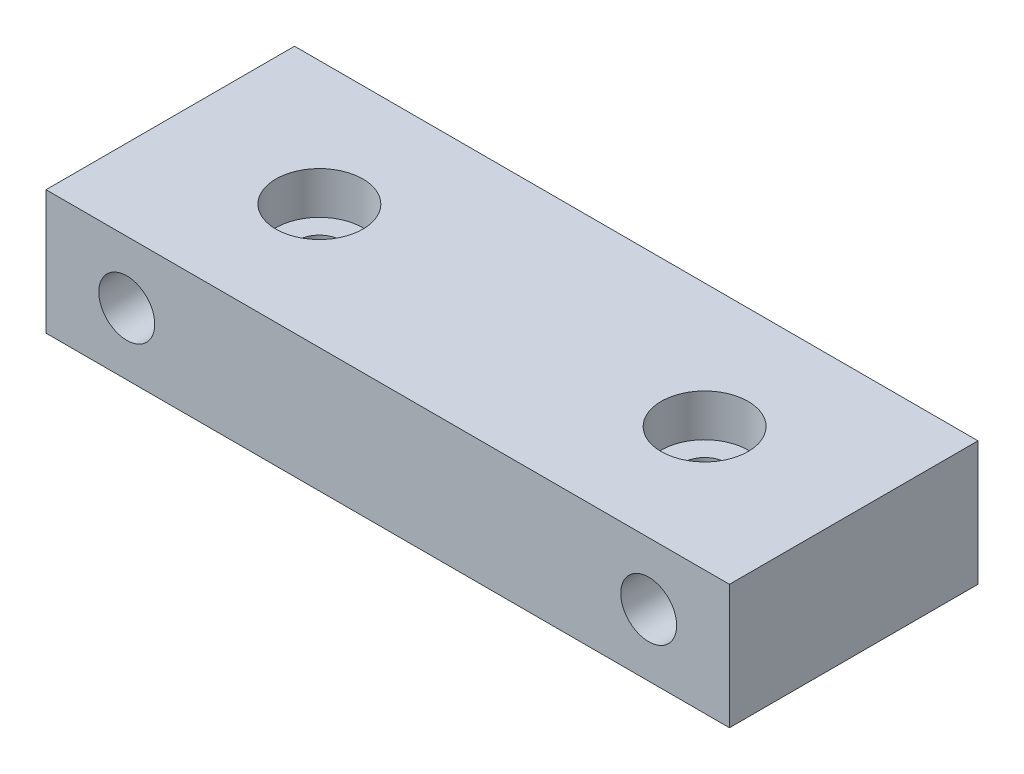
ISO-10303-21;
HEADER;
FILE_DESCRIPTION(('STEP AP214'),'2;1');
FILE_NAME('part.step','',(''),(''),'','','');
FILE_SCHEMA(('AUTOMOTIVE_DESIGN { 1 0 10303 214 1 1 1 1 }'));
ENDSEC;
DATA;
#1=APPLICATION_CONTEXT('core data for automotive mechanical design processes');
#2=APPLICATION_PROTOCOL_DEFINITION('international standard','automotive_design',2000,#1);
#3=PRODUCT_CONTEXT('',#1,'mechanical');
#4=PRODUCT('Part','Part','',(#3));
#5=PRODUCT_RELATED_PRODUCT_CATEGORY('part','',(#4));
#6=PRODUCT_DEFINITION_FORMATION('','',#4);
#7=PRODUCT_DEFINITION_CONTEXT('part definition',#1,'design');
#8=PRODUCT_DEFINITION('design','',#6,#7);
#9=PRODUCT_DEFINITION_SHAPE('','',#8);
#10=(LENGTH_UNIT() NAMED_UNIT(*) SI_UNIT(.MILLI.,.METRE.));
#11=(NAMED_UNIT(*) PLANE_ANGLE_UNIT() SI_UNIT($,.RADIAN.));
#12=(NAMED_UNIT(*) SI_UNIT($,.STERADIAN.) SOLID_ANGLE_UNIT());
#13=UNCERTAINTY_MEASURE_WITH_UNIT(LENGTH_MEASURE(1.E-05),#10,'distance_accuracy_value','');
#14=(GEOMETRIC_REPRESENTATION_CONTEXT(3) GLOBAL_UNCERTAINTY_ASSIGNED_CONTEXT((#13)) GLOBAL_UNIT_ASSIGNED_CONTEXT((#10,
#11,#12)) REPRESENTATION_CONTEXT('',''));
#15=CARTESIAN_POINT('',(0.,0.,0.));
#16=DIRECTION('',(0.,0.,1.));
#17=DIRECTION('',(1.,0.,0.));
#18=AXIS2_PLACEMENT_3D('',#15,#16,#17);
#19=CARTESIAN_POINT('',(21.,5.,-10.));
#20=DIRECTION('',(0.,0.,1.));
#21=DIRECTION('',(1.,0.,0.));
#22=AXIS2_PLACEMENT_3D('',#19,#20,#21);
#23=CYLINDRICAL_SURFACE('',#22,2.25);
#24=CARTESIAN_POINT('',(21.,5.,10.));
#25=DIRECTION('',(0.,0.,1.));
#26=DIRECTION('',(1.,0.,0.));
#27=AXIS2_PLACEMENT_3D('',#24,#25,#26);
#28=CIRCLE('',#27,2.25);
#29=CARTESIAN_POINT('',(23.25,5.,10.));
#30=VERTEX_POINT('',#29);
#31=EDGE_CURVE('E267',#30,#30,#28,.T.);
#32=ORIENTED_EDGE('',*,*,#31,.T.);
#33=EDGE_LOOP('',(#32));
#34=FACE_BOUND('',#33,.T.);
#35=CARTESIAN_POINT('',(21.,5.,-6.00000000000001));
#36=DIRECTION('',(0.,0.,-1.));
#37=DIRECTION('',(-1.,0.,0.));
#38=AXIS2_PLACEMENT_3D('',#35,#36,#37);
#39=CIRCLE('',#38,2.25);
#40=CARTESIAN_POINT('',(18.75,5.,-6.00000000000001));
#41=VERTEX_POINT('',#40);
#42=EDGE_CURVE('E37',#41,#41,#39,.F.);
#43=ORIENTED_EDGE('',*,*,#42,.F.);
#44=EDGE_LOOP('',(#43));
#45=FACE_BOUND('',#44,.T.);
#46=ADVANCED_FACE('F33',(#34,#45),#23,.F.);
#47=CARTESIAN_POINT('',(-21.,5.,-10.));
#48=DIRECTION('',(0.,0.,1.));
#49=DIRECTION('',(1.,0.,0.));
#50=AXIS2_PLACEMENT_3D('',#47,#48,#49);
#51=CYLINDRICAL_SURFACE('',#50,2.25);
#52=CARTESIAN_POINT('',(-21.,5.,10.));
#53=DIRECTION('',(0.,0.,1.));
#54=DIRECTION('',(1.,0.,0.));
#55=AXIS2_PLACEMENT_3D('',#52,#53,#54);
#56=CIRCLE('',#55,2.25);
#57=CARTESIAN_POINT('',(-18.75,5.,10.));
#58=VERTEX_POINT('',#57);
#59=EDGE_CURVE('E271',#58,#58,#56,.T.);
#60=ORIENTED_EDGE('',*,*,#59,.T.);
#61=EDGE_LOOP('',(#60));
#62=FACE_BOUND('',#61,.T.);
#63=CARTESIAN_POINT('',(-21.,5.,-6.00000000000001));
#64=DIRECTION('',(0.,0.,-1.));
#65=DIRECTION('',(-1.,0.,0.));
#66=AXIS2_PLACEMENT_3D('',#63,#64,#65);
#67=CIRCLE('',#66,2.25);
#68=CARTESIAN_POINT('',(-23.25,5.,-6.00000000000001));
#69=VERTEX_POINT('',#68);
#70=EDGE_CURVE('E197',#69,#69,#67,.F.);
#71=ORIENTED_EDGE('',*,*,#70,.F.);
#72=EDGE_LOOP('',(#71));
#73=FACE_BOUND('',#72,.T.);
#74=ADVANCED_FACE('F312',(#62,#73),#51,.F.);
#75=CARTESIAN_POINT('',(27.5,10.,10.));
#76=DIRECTION('',(-1.,0.,0.));
#77=DIRECTION('',(0.,0.,1.));
#78=AXIS2_PLACEMENT_3D('',#75,#76,#77);
#79=PLANE('',#78);
#80=DIRECTION('',(0.,0.,-1.));
#81=VECTOR('',#80,1.);
#82=CARTESIAN_POINT('',(27.5,0.,10.));
#83=LINE('',#82,#81);
#84=CARTESIAN_POINT('',(27.5,0.,10.));
#85=VERTEX_POINT('',#84);
#86=CARTESIAN_POINT('',(27.5,0.,-10.));
#87=VERTEX_POINT('',#86);
#88=EDGE_CURVE('E274',#85,#87,#83,.T.);
#89=ORIENTED_EDGE('',*,*,#88,.T.);
#90=DIRECTION('',(0.,-1.,0.));
#91=VECTOR('',#90,1.);
#92=CARTESIAN_POINT('',(27.5,10.,-10.));
#93=LINE('',#92,#91);
#94=CARTESIAN_POINT('',(27.5,10.,-10.));
#95=VERTEX_POINT('',#94);
#96=EDGE_CURVE('E11',#95,#87,#93,.T.);
#97=ORIENTED_EDGE('',*,*,#96,.F.);
#98=DIRECTION('',(0.,0.,-1.));
#99=VECTOR('',#98,1.);
#100=CARTESIAN_POINT('',(27.5,10.,10.));
#101=LINE('',#100,#99);
#102=CARTESIAN_POINT('',(27.5,10.,10.));
#103=VERTEX_POINT('',#102);
#104=EDGE_CURVE('E277',#103,#95,#101,.T.);
#105=ORIENTED_EDGE('',*,*,#104,.F.);
#106=DIRECTION('',(0.,-1.,0.));
#107=VECTOR('',#106,1.);
#108=CARTESIAN_POINT('',(27.5,10.,10.));
#109=LINE('',#108,#107);
#110=EDGE_CURVE('E287',#103,#85,#109,.T.);
#111=ORIENTED_EDGE('',*,*,#110,.T.);
#112=EDGE_LOOP('',(#89,#97,#105,#111));
#113=FACE_BOUND('',#112,.T.);
#114=ADVANCED_FACE('F35',(#113),#79,.F.);
#115=CARTESIAN_POINT('',(-27.5,10.,-10.));
#116=DIRECTION('',(0.,0.,1.));
#117=DIRECTION('',(1.,0.,0.));
#118=AXIS2_PLACEMENT_3D('',#115,#116,#117);
#119=PLANE('',#118);
#120=DIRECTION('',(0.5,0.866025403784439,0.));
#121=VECTOR('',#120,1.);
#122=CARTESIAN_POINT('',(16.7276080079968,5.,-10.));
#123=LINE('',#122,#121);
#124=CARTESIAN_POINT('',(16.7276080079968,5.,-10.));
#125=VERTEX_POINT('',#124);
#126=CARTESIAN_POINT('',(18.8638040039984,8.7,-10.));
#127=VERTEX_POINT('',#126);
#128=EDGE_CURVE('E184',#125,#127,#123,.T.);
#129=ORIENTED_EDGE('',*,*,#128,.F.);
#130=DIRECTION('',(-0.5,0.866025403784439,0.));
#131=VECTOR('',#130,1.);
#132=CARTESIAN_POINT('',(18.8638040039984,1.29999999999999,-10.));
#133=LINE('',#132,#131);
#134=CARTESIAN_POINT('',(18.8638040039984,1.29999999999999,-10.));
#135=VERTEX_POINT('',#134);
#136=EDGE_CURVE('E50',#135,#125,#133,.T.);
#137=ORIENTED_EDGE('',*,*,#136,.F.);
#138=DIRECTION('',(-1.,0.,0.));
#139=VECTOR('',#138,1.);
#140=CARTESIAN_POINT('',(23.1361959960016,1.3,-10.));
#141=LINE('',#140,#139);
#142=CARTESIAN_POINT('',(23.1361959960016,1.3,-10.));
#143=VERTEX_POINT('',#142);
#144=EDGE_CURVE('E170',#143,#135,#141,.T.);
#145=ORIENTED_EDGE('',*,*,#144,.F.);
#146=DIRECTION('',(-0.5,-0.866025403784439,0.));
#147=VECTOR('',#146,1.);
#148=CARTESIAN_POINT('',(25.2723919920032,5.,-10.));
#149=LINE('',#148,#147);
#150=CARTESIAN_POINT('',(25.2723919920032,5.,-10.));
#151=VERTEX_POINT('',#150);
#152=EDGE_CURVE('E173',#151,#143,#149,.T.);
#153=ORIENTED_EDGE('',*,*,#152,.F.);
#154=DIRECTION('',(0.5,-0.866025403784439,0.));
#155=VECTOR('',#154,1.);
#156=CARTESIAN_POINT('',(23.1361959960016,8.7,-10.));
#157=LINE('',#156,#155);
#158=CARTESIAN_POINT('',(23.1361959960016,8.7,-10.));
#159=VERTEX_POINT('',#158);
#160=EDGE_CURVE('E190',#159,#151,#157,.T.);
#161=ORIENTED_EDGE('',*,*,#160,.F.);
#162=DIRECTION('',(1.,0.,0.));
#163=VECTOR('',#162,1.);
#164=CARTESIAN_POINT('',(18.8638040039984,8.7,-10.));
#165=LINE('',#164,#163);
#166=EDGE_CURVE('E187',#127,#159,#165,.T.);
#167=ORIENTED_EDGE('',*,*,#166,.F.);
#168=EDGE_LOOP('',(#129,#137,#145,#153,#161,#167));
#169=FACE_BOUND('',#168,.T.);
#170=DIRECTION('',(-0.5,-0.866025403784438,0.));
#171=VECTOR('',#170,1.);
#172=CARTESIAN_POINT('',(-16.7276080079968,5.,-10.));
#173=LINE('',#172,#171);
#174=CARTESIAN_POINT('',(-16.7276080079968,5.,-10.));
#175=VERTEX_POINT('',#174);
#176=CARTESIAN_POINT('',(-18.8638040039984,1.3,-10.));
#177=VERTEX_POINT('',#176);
#178=EDGE_CURVE('E226',#175,#177,#173,.T.);
#179=ORIENTED_EDGE('',*,*,#178,.F.);
#180=DIRECTION('',(0.5,-0.866025403784439,0.));
#181=VECTOR('',#180,1.);
#182=CARTESIAN_POINT('',(-18.8638040039984,8.7,-10.));
#183=LINE('',#182,#181);
#184=CARTESIAN_POINT('',(-18.8638040039984,8.7,-10.));
#185=VERTEX_POINT('',#184);
#186=EDGE_CURVE('E58',#185,#175,#183,.T.);
#187=ORIENTED_EDGE('',*,*,#186,.F.);
#188=DIRECTION('',(1.,0.,0.));
#189=VECTOR('',#188,1.);
#190=CARTESIAN_POINT('',(-23.1361959960016,8.7,-10.));
#191=LINE('',#190,#189);
#192=CARTESIAN_POINT('',(-23.1361959960016,8.7,-10.));
#193=VERTEX_POINT('',#192);
#194=EDGE_CURVE('E209',#193,#185,#191,.T.);
#195=ORIENTED_EDGE('',*,*,#194,.F.);
#196=DIRECTION('',(0.5,0.866025403784439,0.));
#197=VECTOR('',#196,1.);
#198=CARTESIAN_POINT('',(-25.2723919920032,5.,-10.));
#199=LINE('',#198,#197);
#200=CARTESIAN_POINT('',(-25.2723919920032,5.,-10.));
#201=VERTEX_POINT('',#200);
#202=EDGE_CURVE('E235',#201,#193,#199,.T.);
#203=ORIENTED_EDGE('',*,*,#202,.F.);
#204=DIRECTION('',(-0.499999999999999,0.866025403784439,0.));
#205=VECTOR('',#204,1.);
#206=CARTESIAN_POINT('',(-23.1361959960016,1.3,-10.));
#207=LINE('',#206,#205);
#208=CARTESIAN_POINT('',(-23.1361959960016,1.3,-10.));
#209=VERTEX_POINT('',#208);
#210=EDGE_CURVE('E232',#209,#201,#207,.T.);
#211=ORIENTED_EDGE('',*,*,#210,.F.);
#212=DIRECTION('',(-1.,0.,0.));
#213=VECTOR('',#212,1.);
#214=CARTESIAN_POINT('',(-18.8638040039984,1.3,-10.));
#215=LINE('',#214,#213);
#216=EDGE_CURVE('E229',#177,#209,#215,.T.);
#217=ORIENTED_EDGE('',*,*,#216,.F.);
#218=EDGE_LOOP('',(#179,#187,#195,#203,#211,#217));
#219=FACE_BOUND('',#218,.T.);
#220=DIRECTION('',(-1.,0.,0.));
#221=VECTOR('',#220,1.);
#222=CARTESIAN_POINT('',(-27.5,0.,-10.));
#223=LINE('',#222,#221);
#224=CARTESIAN_POINT('',(-27.5,0.,-10.));
#225=VERTEX_POINT('',#224);
#226=EDGE_CURVE('E290',#87,#225,#223,.T.);
#227=ORIENTED_EDGE('',*,*,#226,.T.);
#228=DIRECTION('',(0.,-1.,0.));
#229=VECTOR('',#228,1.);
#230=CARTESIAN_POINT('',(-27.5,10.,-10.));
#231=LINE('',#230,#229);
#232=CARTESIAN_POINT('',(-27.5,10.,-10.));
#233=VERTEX_POINT('',#232);
#234=EDGE_CURVE('E42',#233,#225,#231,.T.);
#235=ORIENTED_EDGE('',*,*,#234,.F.);
#236=DIRECTION('',(-1.,0.,0.));
#237=VECTOR('',#236,1.);
#238=CARTESIAN_POINT('',(-27.5,10.,-10.));
#239=LINE('',#238,#237);
#240=EDGE_CURVE('E280',#95,#233,#239,.T.);
#241=ORIENTED_EDGE('',*,*,#240,.F.);
#242=ORIENTED_EDGE('',*,*,#96,.T.);
#243=EDGE_LOOP('',(#227,#235,#241,#242));
#244=FACE_BOUND('',#243,.T.);
#245=ADVANCED_FACE('F337',(#169,#219,#244),#119,.F.);
#246=CARTESIAN_POINT('',(-27.5,10.,10.));
#247=DIRECTION('',(1.,0.,0.));
#248=DIRECTION('',(0.,0.,-1.));
#249=AXIS2_PLACEMENT_3D('',#246,#247,#248);
#250=PLANE('',#249);
#251=DIRECTION('',(0.,0.,1.));
#252=VECTOR('',#251,1.);
#253=CARTESIAN_POINT('',(-27.5,0.,10.));
#254=LINE('',#253,#252);
#255=CARTESIAN_POINT('',(-27.5,0.,10.));
#256=VERTEX_POINT('',#255);
#257=EDGE_CURVE('E292',#225,#256,#254,.T.);
#258=ORIENTED_EDGE('',*,*,#257,.T.);
#259=DIRECTION('',(0.,-1.,0.));
#260=VECTOR('',#259,1.);
#261=CARTESIAN_POINT('',(-27.5,10.,10.));
#262=LINE('',#261,#260);
#263=CARTESIAN_POINT('',(-27.5,10.,10.));
#264=VERTEX_POINT('',#263);
#265=EDGE_CURVE('E297',#264,#256,#262,.T.);
#266=ORIENTED_EDGE('',*,*,#265,.F.);
#267=DIRECTION('',(0.,0.,1.));
#268=VECTOR('',#267,1.);
#269=CARTESIAN_POINT('',(-27.5,10.,10.));
#270=LINE('',#269,#268);
#271=EDGE_CURVE('E283',#233,#264,#270,.T.);
#272=ORIENTED_EDGE('',*,*,#271,.F.);
#273=ORIENTED_EDGE('',*,*,#234,.T.);
#274=EDGE_LOOP('',(#258,#266,#272,#273));
#275=FACE_BOUND('',#274,.T.);
#276=ADVANCED_FACE('F334',(#275),#250,.F.);
#277=CARTESIAN_POINT('',(-27.5,10.,10.));
#278=DIRECTION('',(0.,0.,-1.));
#279=DIRECTION('',(-1.,0.,0.));
#280=AXIS2_PLACEMENT_3D('',#277,#278,#279);
#281=PLANE('',#280);
#282=ORIENTED_EDGE('',*,*,#59,.F.);
#283=EDGE_LOOP('',(#282));
#284=FACE_BOUND('',#283,.T.);
#285=ORIENTED_EDGE('',*,*,#31,.F.);
#286=EDGE_LOOP('',(#285));
#287=FACE_BOUND('',#286,.T.);
#288=DIRECTION('',(1.,0.,0.));
#289=VECTOR('',#288,1.);
#290=CARTESIAN_POINT('',(-27.5,0.,10.));
#291=LINE('',#290,#289);
#292=EDGE_CURVE('E281',#256,#85,#291,.T.);
#293=ORIENTED_EDGE('',*,*,#292,.T.);
#294=ORIENTED_EDGE('',*,*,#110,.F.);
#295=DIRECTION('',(1.,0.,0.));
#296=VECTOR('',#295,1.);
#297=CARTESIAN_POINT('',(-27.5,10.,10.));
#298=LINE('',#297,#296);
#299=EDGE_CURVE('E285',#264,#103,#298,.T.);
#300=ORIENTED_EDGE('',*,*,#299,.F.);
#301=ORIENTED_EDGE('',*,*,#265,.T.);
#302=EDGE_LOOP('',(#293,#294,#300,#301));
#303=FACE_BOUND('',#302,.T.);
#304=ADVANCED_FACE('F326',(#284,#287,#303),#281,.F.);
#305=CARTESIAN_POINT('',(0.,10.,0.));
#306=DIRECTION('',(0.,-1.,0.));
#307=DIRECTION('',(0.,0.,-1.));
#308=AXIS2_PLACEMENT_3D('',#305,#306,#307);
#309=PLANE('',#308);
#310=CARTESIAN_POINT('',(-15.5,10.,0.));
#311=DIRECTION('',(0.,1.,0.));
#312=DIRECTION('',(0.,0.,1.));
#313=AXIS2_PLACEMENT_3D('',#310,#311,#312);
#314=CIRCLE('',#313,3.5);
#315=CARTESIAN_POINT('',(-15.5,10.,3.5));
#316=VERTEX_POINT('',#315);
#317=EDGE_CURVE('E250',#316,#316,#314,.T.);
#318=ORIENTED_EDGE('',*,*,#317,.F.);
#319=EDGE_LOOP('',(#318));
#320=FACE_BOUND('',#319,.T.);
#321=CARTESIAN_POINT('',(15.5,10.,0.));
#322=DIRECTION('',(0.,1.,0.));
#323=DIRECTION('',(0.,0.,1.));
#324=AXIS2_PLACEMENT_3D('',#321,#322,#323);
#325=CIRCLE('',#324,3.5);
#326=CARTESIAN_POINT('',(15.5,10.,3.5));
#327=VERTEX_POINT('',#326);
#328=EDGE_CURVE('E257',#327,#327,#325,.T.);
#329=ORIENTED_EDGE('',*,*,#328,.F.);
#330=EDGE_LOOP('',(#329));
#331=FACE_BOUND('',#330,.T.);
#332=ORIENTED_EDGE('',*,*,#104,.T.);
#333=ORIENTED_EDGE('',*,*,#240,.T.);
#334=ORIENTED_EDGE('',*,*,#271,.T.);
#335=ORIENTED_EDGE('',*,*,#299,.T.);
#336=EDGE_LOOP('',(#332,#333,#334,#335));
#337=FACE_BOUND('',#336,.T.);
#338=ADVANCED_FACE('F322',(#320,#331,#337),#309,.F.);
#339=CARTESIAN_POINT('',(0.,0.,0.));
#340=DIRECTION('',(0.,-1.,0.));
#341=DIRECTION('',(0.,0.,-1.));
#342=AXIS2_PLACEMENT_3D('',#339,#340,#341);
#343=PLANE('',#342);
#344=CARTESIAN_POINT('',(-15.5,0.,0.));
#345=DIRECTION('',(0.,1.,0.));
#346=DIRECTION('',(0.,0.,1.));
#347=AXIS2_PLACEMENT_3D('',#344,#345,#346);
#348=CIRCLE('',#347,1.75);
#349=CARTESIAN_POINT('',(-15.5,0.,1.75));
#350=VERTEX_POINT('',#349);
#351=EDGE_CURVE('E264',#350,#350,#348,.T.);
#352=ORIENTED_EDGE('',*,*,#351,.T.);
#353=EDGE_LOOP('',(#352));
#354=FACE_BOUND('',#353,.T.);
#355=CARTESIAN_POINT('',(15.5,0.,0.));
#356=DIRECTION('',(0.,1.,0.));
#357=DIRECTION('',(0.,0.,1.));
#358=AXIS2_PLACEMENT_3D('',#355,#356,#357);
#359=CIRCLE('',#358,1.75);
#360=CARTESIAN_POINT('',(15.5,0.,1.75));
#361=VERTEX_POINT('',#360);
#362=EDGE_CURVE('E268',#361,#361,#359,.T.);
#363=ORIENTED_EDGE('',*,*,#362,.T.);
#364=EDGE_LOOP('',(#363));
#365=FACE_BOUND('',#364,.T.);
#366=ORIENTED_EDGE('',*,*,#88,.F.);
#367=ORIENTED_EDGE('',*,*,#292,.F.);
#368=ORIENTED_EDGE('',*,*,#257,.F.);
#369=ORIENTED_EDGE('',*,*,#226,.F.);
#370=EDGE_LOOP('',(#366,#367,#368,#369));
#371=FACE_BOUND('',#370,.T.);
#372=ADVANCED_FACE('F325',(#354,#365,#371),#343,.T.);
#373=CARTESIAN_POINT('',(15.5,0.,0.));
#374=DIRECTION('',(0.,1.,0.));
#375=DIRECTION('',(0.,0.,1.));
#376=AXIS2_PLACEMENT_3D('',#373,#374,#375);
#377=CYLINDRICAL_SURFACE('',#376,1.75);
#378=CARTESIAN_POINT('',(15.5,6.6,0.));
#379=DIRECTION('',(0.,-1.,0.));
#380=DIRECTION('',(0.,0.,-1.));
#381=AXIS2_PLACEMENT_3D('',#378,#379,#380);
#382=CIRCLE('',#381,1.75);
#383=CARTESIAN_POINT('',(15.5,6.6,-1.75));
#384=VERTEX_POINT('',#383);
#385=EDGE_CURVE('E263',#384,#384,#382,.F.);
#386=ORIENTED_EDGE('',*,*,#385,.T.);
#387=EDGE_LOOP('',(#386));
#388=FACE_BOUND('',#387,.T.);
#389=ORIENTED_EDGE('',*,*,#362,.F.);
#390=EDGE_LOOP('',(#389));
#391=FACE_BOUND('',#390,.T.);
#392=ADVANCED_FACE('F330',(#388,#391),#377,.F.);
#393=CARTESIAN_POINT('',(-15.5,0.,0.));
#394=DIRECTION('',(0.,1.,0.));
#395=DIRECTION('',(0.,0.,1.));
#396=AXIS2_PLACEMENT_3D('',#393,#394,#395);
#397=CYLINDRICAL_SURFACE('',#396,1.75);
#398=CARTESIAN_POINT('',(-15.5,6.6,0.));
#399=DIRECTION('',(0.,-1.,0.));
#400=DIRECTION('',(0.,0.,-1.));
#401=AXIS2_PLACEMENT_3D('',#398,#399,#400);
#402=CIRCLE('',#401,1.75);
#403=CARTESIAN_POINT('',(-15.5,6.6,-1.75));
#404=VERTEX_POINT('',#403);
#405=EDGE_CURVE('E256',#404,#404,#402,.F.);
#406=ORIENTED_EDGE('',*,*,#405,.T.);
#407=EDGE_LOOP('',(#406));
#408=FACE_BOUND('',#407,.T.);
#409=ORIENTED_EDGE('',*,*,#351,.F.);
#410=EDGE_LOOP('',(#409));
#411=FACE_BOUND('',#410,.T.);
#412=ADVANCED_FACE('F412',(#408,#411),#397,.F.);
#413=CARTESIAN_POINT('',(17.2,6.6,0.));
#414=DIRECTION('',(0.,-1.,0.));
#415=DIRECTION('',(0.,0.,-1.));
#416=AXIS2_PLACEMENT_3D('',#413,#414,#415);
#417=PLANE('',#416);
#418=CARTESIAN_POINT('',(15.5,6.6,0.));
#419=DIRECTION('',(0.,1.,0.));
#420=DIRECTION('',(0.,0.,1.));
#421=AXIS2_PLACEMENT_3D('',#418,#419,#420);
#422=CIRCLE('',#421,3.5);
#423=CARTESIAN_POINT('',(15.5,6.6,3.5));
#424=VERTEX_POINT('',#423);
#425=EDGE_CURVE('E260',#424,#424,#422,.T.);
#426=ORIENTED_EDGE('',*,*,#425,.T.);
#427=EDGE_LOOP('',(#426));
#428=FACE_BOUND('',#427,.T.);
#429=ORIENTED_EDGE('',*,*,#385,.F.);
#430=EDGE_LOOP('',(#429));
#431=FACE_BOUND('',#430,.T.);
#432=ADVANCED_FACE('F408',(#428,#431),#417,.F.);
#433=CARTESIAN_POINT('',(15.5,10.,0.));
#434=DIRECTION('',(0.,1.,0.));
#435=DIRECTION('',(0.,0.,1.));
#436=AXIS2_PLACEMENT_3D('',#433,#434,#435);
#437=CYLINDRICAL_SURFACE('',#436,3.5);
#438=ORIENTED_EDGE('',*,*,#425,.F.);
#439=EDGE_LOOP('',(#438));
#440=FACE_BOUND('',#439,.T.);
#441=ORIENTED_EDGE('',*,*,#328,.T.);
#442=EDGE_LOOP('',(#441));
#443=FACE_BOUND('',#442,.T.);
#444=ADVANCED_FACE('F404',(#440,#443),#437,.F.);
#445=CARTESIAN_POINT('',(-13.8,6.6,0.));
#446=DIRECTION('',(0.,-1.,0.));
#447=DIRECTION('',(0.,0.,-1.));
#448=AXIS2_PLACEMENT_3D('',#445,#446,#447);
#449=PLANE('',#448);
#450=CARTESIAN_POINT('',(-15.5,6.6,0.));
#451=DIRECTION('',(0.,1.,0.));
#452=DIRECTION('',(0.,0.,1.));
#453=AXIS2_PLACEMENT_3D('',#450,#451,#452);
#454=CIRCLE('',#453,3.5);
#455=CARTESIAN_POINT('',(-15.5,6.6,3.5));
#456=VERTEX_POINT('',#455);
#457=EDGE_CURVE('E253',#456,#456,#454,.T.);
#458=ORIENTED_EDGE('',*,*,#457,.T.);
#459=EDGE_LOOP('',(#458));
#460=FACE_BOUND('',#459,.T.);
#461=ORIENTED_EDGE('',*,*,#405,.F.);
#462=EDGE_LOOP('',(#461));
#463=FACE_BOUND('',#462,.T.);
#464=ADVANCED_FACE('F400',(#460,#463),#449,.F.);
#465=CARTESIAN_POINT('',(-15.5,10.,0.));
#466=DIRECTION('',(0.,1.,0.));
#467=DIRECTION('',(0.,0.,1.));
#468=AXIS2_PLACEMENT_3D('',#465,#466,#467);
#469=CYLINDRICAL_SURFACE('',#468,3.5);
#470=ORIENTED_EDGE('',*,*,#457,.F.);
#471=EDGE_LOOP('',(#470));
#472=FACE_BOUND('',#471,.T.);
#473=ORIENTED_EDGE('',*,*,#317,.T.);
#474=EDGE_LOOP('',(#473));
#475=FACE_BOUND('',#474,.T.);
#476=ADVANCED_FACE('F397',(#472,#475),#469,.F.);
#477=CARTESIAN_POINT('',(0.,0.,-6.00000000000001));
#478=DIRECTION('',(0.,0.,-1.));
#479=DIRECTION('',(-1.,0.,0.));
#480=AXIS2_PLACEMENT_3D('',#477,#478,#479);
#481=PLANE('',#480);
#482=DIRECTION('',(0.5,-0.866025403784439,0.));
#483=VECTOR('',#482,1.);
#484=CARTESIAN_POINT('',(-18.8638040039984,8.7,-6.00000000000001));
#485=LINE('',#484,#483);
#486=CARTESIAN_POINT('',(-18.8638040039984,8.7,-6.00000000000001));
#487=VERTEX_POINT('',#486);
#488=CARTESIAN_POINT('',(-16.7276080079968,5.,-6.00000000000001));
#489=VERTEX_POINT('',#488);
#490=EDGE_CURVE('E205',#487,#489,#485,.T.);
#491=ORIENTED_EDGE('',*,*,#490,.T.);
#492=DIRECTION('',(-0.5,-0.866025403784438,0.));
#493=VECTOR('',#492,1.);
#494=CARTESIAN_POINT('',(-16.7276080079968,5.,-6.00000000000001));
#495=LINE('',#494,#493);
#496=CARTESIAN_POINT('',(-18.8638040039984,1.3,-6.00000000000001));
#497=VERTEX_POINT('',#496);
#498=EDGE_CURVE('E208',#489,#497,#495,.T.);
#499=ORIENTED_EDGE('',*,*,#498,.T.);
#500=DIRECTION('',(-1.,0.,0.));
#501=VECTOR('',#500,1.);
#502=CARTESIAN_POINT('',(-18.8638040039984,1.3,-6.00000000000001));
#503=LINE('',#502,#501);
#504=CARTESIAN_POINT('',(-23.1361959960016,1.3,-6.00000000000001));
#505=VERTEX_POINT('',#504);
#506=EDGE_CURVE('E212',#497,#505,#503,.T.);
#507=ORIENTED_EDGE('',*,*,#506,.T.);
#508=DIRECTION('',(-0.499999999999999,0.866025403784439,0.));
#509=VECTOR('',#508,1.);
#510=CARTESIAN_POINT('',(-23.1361959960016,1.3,-6.00000000000001));
#511=LINE('',#510,#509);
#512=CARTESIAN_POINT('',(-25.2723919920032,5.,-6.00000000000001));
#513=VERTEX_POINT('',#512);
#514=EDGE_CURVE('E215',#505,#513,#511,.T.);
#515=ORIENTED_EDGE('',*,*,#514,.T.);
#516=DIRECTION('',(0.5,0.866025403784439,0.));
#517=VECTOR('',#516,1.);
#518=CARTESIAN_POINT('',(-25.2723919920032,5.,-6.00000000000001));
#519=LINE('',#518,#517);
#520=CARTESIAN_POINT('',(-23.1361959960016,8.7,-6.00000000000001));
#521=VERTEX_POINT('',#520);
#522=EDGE_CURVE('E218',#513,#521,#519,.T.);
#523=ORIENTED_EDGE('',*,*,#522,.T.);
#524=DIRECTION('',(1.,0.,0.));
#525=VECTOR('',#524,1.);
#526=CARTESIAN_POINT('',(-23.1361959960016,8.7,-6.00000000000001));
#527=LINE('',#526,#525);
#528=EDGE_CURVE('E221',#521,#487,#527,.T.);
#529=ORIENTED_EDGE('',*,*,#528,.T.);
#530=EDGE_LOOP('',(#491,#499,#507,#515,#523,#529));
#531=FACE_BOUND('',#530,.T.);
#532=ORIENTED_EDGE('',*,*,#70,.T.);
#533=EDGE_LOOP('',(#532));
#534=FACE_BOUND('',#533,.T.);
#535=ADVANCED_FACE('F373',(#531,#534),#481,.T.);
#536=CARTESIAN_POINT('',(-18.8638040039984,8.7,-6.00000000000001));
#537=DIRECTION('',(0.866025403784439,0.5,0.));
#538=DIRECTION('',(-0.5,0.866025403784439,0.));
#539=AXIS2_PLACEMENT_3D('',#536,#537,#538);
#540=PLANE('',#539);
#541=ORIENTED_EDGE('',*,*,#186,.T.);
#542=DIRECTION('',(0.,0.,-1.));
#543=VECTOR('',#542,1.);
#544=CARTESIAN_POINT('',(-16.7276080079968,5.,-6.00000000000001));
#545=LINE('',#544,#543);
#546=EDGE_CURVE('E224',#489,#175,#545,.T.);
#547=ORIENTED_EDGE('',*,*,#546,.F.);
#548=ORIENTED_EDGE('',*,*,#490,.F.);
#549=DIRECTION('',(0.,0.,-1.));
#550=VECTOR('',#549,1.);
#551=CARTESIAN_POINT('',(-18.8638040039984,8.7,-6.00000000000001));
#552=LINE('',#551,#550);
#553=EDGE_CURVE('E185',#487,#185,#552,.T.);
#554=ORIENTED_EDGE('',*,*,#553,.T.);
#555=EDGE_LOOP('',(#541,#547,#548,#554));
#556=FACE_BOUND('',#555,.T.);
#557=ADVANCED_FACE('F370',(#556),#540,.F.);
#558=CARTESIAN_POINT('',(-23.1361959960016,8.7,-6.00000000000001));
#559=DIRECTION('',(0.,1.,0.));
#560=DIRECTION('',(0.,0.,1.));
#561=AXIS2_PLACEMENT_3D('',#558,#559,#560);
#562=PLANE('',#561);
#563=ORIENTED_EDGE('',*,*,#194,.T.);
#564=ORIENTED_EDGE('',*,*,#553,.F.);
#565=ORIENTED_EDGE('',*,*,#528,.F.);
#566=DIRECTION('',(0.,0.,-1.));
#567=VECTOR('',#566,1.);
#568=CARTESIAN_POINT('',(-23.1361959960016,8.7,-6.00000000000001));
#569=LINE('',#568,#567);
#570=EDGE_CURVE('E241',#521,#193,#569,.T.);
#571=ORIENTED_EDGE('',*,*,#570,.T.);
#572=EDGE_LOOP('',(#563,#564,#565,#571));
#573=FACE_BOUND('',#572,.T.);
#574=ADVANCED_FACE('F376',(#573),#562,.F.);
#575=CARTESIAN_POINT('',(-25.2723919920032,5.,-6.00000000000001));
#576=DIRECTION('',(-0.866025403784439,0.5,0.));
#577=DIRECTION('',(-0.5,-0.866025403784439,0.));
#578=AXIS2_PLACEMENT_3D('',#575,#576,#577);
#579=PLANE('',#578);
#580=ORIENTED_EDGE('',*,*,#202,.T.);
#581=ORIENTED_EDGE('',*,*,#570,.F.);
#582=ORIENTED_EDGE('',*,*,#522,.F.);
#583=DIRECTION('',(0.,0.,-1.));
#584=VECTOR('',#583,1.);
#585=CARTESIAN_POINT('',(-25.2723919920032,5.,-6.00000000000001));
#586=LINE('',#585,#584);
#587=EDGE_CURVE('E243',#513,#201,#586,.T.);
#588=ORIENTED_EDGE('',*,*,#587,.T.);
#589=EDGE_LOOP('',(#580,#581,#582,#588));
#590=FACE_BOUND('',#589,.T.);
#591=ADVANCED_FACE('F379',(#590),#579,.F.);
#592=CARTESIAN_POINT('',(-23.1361959960016,1.3,-6.00000000000001));
#593=DIRECTION('',(-0.866025403784439,-0.499999999999999,0.));
#594=DIRECTION('',(0.499999999999999,-0.866025403784439,0.));
#595=AXIS2_PLACEMENT_3D('',#592,#593,#594);
#596=PLANE('',#595);
#597=ORIENTED_EDGE('',*,*,#210,.T.);
#598=ORIENTED_EDGE('',*,*,#587,.F.);
#599=ORIENTED_EDGE('',*,*,#514,.F.);
#600=DIRECTION('',(0.,0.,-1.));
#601=VECTOR('',#600,1.);
#602=CARTESIAN_POINT('',(-23.1361959960016,1.3,-6.00000000000001));
#603=LINE('',#602,#601);
#604=EDGE_CURVE('E245',#505,#209,#603,.T.);
#605=ORIENTED_EDGE('',*,*,#604,.T.);
#606=EDGE_LOOP('',(#597,#598,#599,#605));
#607=FACE_BOUND('',#606,.T.);
#608=ADVANCED_FACE('F382',(#607),#596,.F.);
#609=CARTESIAN_POINT('',(-18.8638040039984,1.3,-6.00000000000001));
#610=DIRECTION('',(0.,-1.,0.));
#611=DIRECTION('',(1.,0.,0.));
#612=AXIS2_PLACEMENT_3D('',#609,#610,#611);
#613=PLANE('',#612);
#614=ORIENTED_EDGE('',*,*,#216,.T.);
#615=ORIENTED_EDGE('',*,*,#604,.F.);
#616=ORIENTED_EDGE('',*,*,#506,.F.);
#617=DIRECTION('',(0.,0.,-1.));
#618=VECTOR('',#617,1.);
#619=CARTESIAN_POINT('',(-18.8638040039984,1.3,-6.00000000000001));
#620=LINE('',#619,#618);
#621=EDGE_CURVE('E247',#497,#177,#620,.T.);
#622=ORIENTED_EDGE('',*,*,#621,.T.);
#623=EDGE_LOOP('',(#614,#615,#616,#622));
#624=FACE_BOUND('',#623,.T.);
#625=ADVANCED_FACE('F384',(#624),#613,.F.);
#626=CARTESIAN_POINT('',(-16.7276080079968,5.,-6.00000000000001));
#627=DIRECTION('',(0.866025403784438,-0.5,0.));
#628=DIRECTION('',(0.5,0.866025403784438,0.));
#629=AXIS2_PLACEMENT_3D('',#626,#627,#628);
#630=PLANE('',#629);
#631=ORIENTED_EDGE('',*,*,#178,.T.);
#632=ORIENTED_EDGE('',*,*,#621,.F.);
#633=ORIENTED_EDGE('',*,*,#498,.F.);
#634=ORIENTED_EDGE('',*,*,#546,.T.);
#635=EDGE_LOOP('',(#631,#632,#633,#634));
#636=FACE_BOUND('',#635,.T.);
#637=ADVANCED_FACE('F366',(#636),#630,.F.);
#638=CARTESIAN_POINT('',(0.,0.,-6.00000000000001));
#639=DIRECTION('',(0.,0.,-1.));
#640=DIRECTION('',(-1.,0.,0.));
#641=AXIS2_PLACEMENT_3D('',#638,#639,#640);
#642=PLANE('',#641);
#643=DIRECTION('',(-0.5,0.866025403784439,0.));
#644=VECTOR('',#643,1.);
#645=CARTESIAN_POINT('',(18.8638040039984,1.29999999999999,-6.00000000000001));
#646=LINE('',#645,#644);
#647=CARTESIAN_POINT('',(18.8638040039984,1.29999999999999,-6.00000000000001));
#648=VERTEX_POINT('',#647);
#649=CARTESIAN_POINT('',(16.7276080079968,5.,-6.00000000000001));
#650=VERTEX_POINT('',#649);
#651=EDGE_CURVE('E150',#648,#650,#646,.T.);
#652=ORIENTED_EDGE('',*,*,#651,.T.);
#653=DIRECTION('',(0.5,0.866025403784439,0.));
#654=VECTOR('',#653,1.);
#655=CARTESIAN_POINT('',(16.7276080079968,5.,-6.00000000000001));
#656=LINE('',#655,#654);
#657=CARTESIAN_POINT('',(18.8638040039984,8.7,-6.00000000000001));
#658=VERTEX_POINT('',#657);
#659=EDGE_CURVE('E159',#650,#658,#656,.T.);
#660=ORIENTED_EDGE('',*,*,#659,.T.);
#661=DIRECTION('',(1.,0.,0.));
#662=VECTOR('',#661,1.);
#663=CARTESIAN_POINT('',(18.8638040039984,8.7,-6.00000000000001));
#664=LINE('',#663,#662);
#665=CARTESIAN_POINT('',(23.1361959960016,8.7,-6.00000000000001));
#666=VERTEX_POINT('',#665);
#667=EDGE_CURVE('E164',#658,#666,#664,.T.);
#668=ORIENTED_EDGE('',*,*,#667,.T.);
#669=DIRECTION('',(0.5,-0.866025403784439,0.));
#670=VECTOR('',#669,1.);
#671=CARTESIAN_POINT('',(23.1361959960016,8.7,-6.00000000000001));
#672=LINE('',#671,#670);
#673=CARTESIAN_POINT('',(25.2723919920032,5.,-6.00000000000001));
#674=VERTEX_POINT('',#673);
#675=EDGE_CURVE('E177',#666,#674,#672,.T.);
#676=ORIENTED_EDGE('',*,*,#675,.T.);
#677=DIRECTION('',(-0.5,-0.866025403784439,0.));
#678=VECTOR('',#677,1.);
#679=CARTESIAN_POINT('',(25.2723919920032,5.,-6.00000000000001));
#680=LINE('',#679,#678);
#681=CARTESIAN_POINT('',(23.1361959960016,1.3,-6.00000000000001));
#682=VERTEX_POINT('',#681);
#683=EDGE_CURVE('E180',#674,#682,#680,.T.);
#684=ORIENTED_EDGE('',*,*,#683,.T.);
#685=DIRECTION('',(-1.,0.,0.));
#686=VECTOR('',#685,1.);
#687=CARTESIAN_POINT('',(23.1361959960016,1.3,-6.00000000000001));
#688=LINE('',#687,#686);
#689=EDGE_CURVE('E156',#682,#648,#688,.T.);
#690=ORIENTED_EDGE('',*,*,#689,.T.);
#691=EDGE_LOOP('',(#652,#660,#668,#676,#684,#690));
#692=FACE_BOUND('',#691,.T.);
#693=ORIENTED_EDGE('',*,*,#42,.T.);
#694=EDGE_LOOP('',(#693));
#695=FACE_BOUND('',#694,.T.);
#696=ADVANCED_FACE('F166',(#692,#695),#642,.T.);
#697=CARTESIAN_POINT('',(18.8638040039984,1.29999999999999,-6.00000000000001));
#698=DIRECTION('',(-0.866025403784439,-0.5,0.));
#699=DIRECTION('',(0.5,-0.866025403784439,0.));
#700=AXIS2_PLACEMENT_3D('',#697,#698,#699);
#701=PLANE('',#700);
#702=ORIENTED_EDGE('',*,*,#136,.T.);
#703=DIRECTION('',(0.,0.,-1.));
#704=VECTOR('',#703,1.);
#705=CARTESIAN_POINT('',(16.7276080079968,5.,-6.00000000000001));
#706=LINE('',#705,#704);
#707=EDGE_CURVE('E146',#650,#125,#706,.T.);
#708=ORIENTED_EDGE('',*,*,#707,.F.);
#709=ORIENTED_EDGE('',*,*,#651,.F.);
#710=DIRECTION('',(0.,0.,-1.));
#711=VECTOR('',#710,1.);
#712=CARTESIAN_POINT('',(18.8638040039984,1.29999999999999,-6.00000000000001));
#713=LINE('',#712,#711);
#714=EDGE_CURVE('E195',#648,#135,#713,.T.);
#715=ORIENTED_EDGE('',*,*,#714,.T.);
#716=EDGE_LOOP('',(#702,#708,#709,#715));
#717=FACE_BOUND('',#716,.T.);
#718=ADVANCED_FACE('F148',(#717),#701,.F.);
#719=CARTESIAN_POINT('',(23.1361959960016,1.3,-6.00000000000001));
#720=DIRECTION('',(0.,-1.,0.));
#721=DIRECTION('',(1.,0.,0.));
#722=AXIS2_PLACEMENT_3D('',#719,#720,#721);
#723=PLANE('',#722);
#724=ORIENTED_EDGE('',*,*,#144,.T.);
#725=ORIENTED_EDGE('',*,*,#714,.F.);
#726=ORIENTED_EDGE('',*,*,#689,.F.);
#727=DIRECTION('',(0.,0.,-1.));
#728=VECTOR('',#727,1.);
#729=CARTESIAN_POINT('',(23.1361959960016,1.3,-6.00000000000001));
#730=LINE('',#729,#728);
#731=EDGE_CURVE('E198',#682,#143,#730,.T.);
#732=ORIENTED_EDGE('',*,*,#731,.T.);
#733=EDGE_LOOP('',(#724,#725,#726,#732));
#734=FACE_BOUND('',#733,.T.);
#735=ADVANCED_FACE('F500',(#734),#723,.F.);
#736=CARTESIAN_POINT('',(25.2723919920032,5.,-6.00000000000001));
#737=DIRECTION('',(0.866025403784439,-0.5,0.));
#738=DIRECTION('',(0.5,0.866025403784439,0.));
#739=AXIS2_PLACEMENT_3D('',#736,#737,#738);
#740=PLANE('',#739);
#741=ORIENTED_EDGE('',*,*,#152,.T.);
#742=ORIENTED_EDGE('',*,*,#731,.F.);
#743=ORIENTED_EDGE('',*,*,#683,.F.);
#744=DIRECTION('',(0.,0.,-1.));
#745=VECTOR('',#744,1.);
#746=CARTESIAN_POINT('',(25.2723919920032,5.,-6.00000000000001));
#747=LINE('',#746,#745);
#748=EDGE_CURVE('E200',#674,#151,#747,.T.);
#749=ORIENTED_EDGE('',*,*,#748,.T.);
#750=EDGE_LOOP('',(#741,#742,#743,#749));
#751=FACE_BOUND('',#750,.T.);
#752=ADVANCED_FACE('F509',(#751),#740,.F.);
#753=CARTESIAN_POINT('',(23.1361959960016,8.7,-6.00000000000001));
#754=DIRECTION('',(0.866025403784439,0.5,0.));
#755=DIRECTION('',(-0.5,0.866025403784439,0.));
#756=AXIS2_PLACEMENT_3D('',#753,#754,#755);
#757=PLANE('',#756);
#758=ORIENTED_EDGE('',*,*,#160,.T.);
#759=ORIENTED_EDGE('',*,*,#748,.F.);
#760=ORIENTED_EDGE('',*,*,#675,.F.);
#761=DIRECTION('',(0.,0.,-1.));
#762=VECTOR('',#761,1.);
#763=CARTESIAN_POINT('',(23.1361959960016,8.7,-6.00000000000001));
#764=LINE('',#763,#762);
#765=EDGE_CURVE('E202',#666,#159,#764,.T.);
#766=ORIENTED_EDGE('',*,*,#765,.T.);
#767=EDGE_LOOP('',(#758,#759,#760,#766));
#768=FACE_BOUND('',#767,.T.);
#769=ADVANCED_FACE('F519',(#768),#757,.F.);
#770=CARTESIAN_POINT('',(18.8638040039984,8.7,-6.00000000000001));
#771=DIRECTION('',(0.,1.,0.));
#772=DIRECTION('',(0.,0.,1.));
#773=AXIS2_PLACEMENT_3D('',#770,#771,#772);
#774=PLANE('',#773);
#775=ORIENTED_EDGE('',*,*,#166,.T.);
#776=ORIENTED_EDGE('',*,*,#765,.F.);
#777=ORIENTED_EDGE('',*,*,#667,.F.);
#778=DIRECTION('',(0.,0.,-1.));
#779=VECTOR('',#778,1.);
#780=CARTESIAN_POINT('',(18.8638040039984,8.7,-6.00000000000001));
#781=LINE('',#780,#779);
#782=EDGE_CURVE('E155',#658,#127,#781,.T.);
#783=ORIENTED_EDGE('',*,*,#782,.T.);
#784=EDGE_LOOP('',(#775,#776,#777,#783));
#785=FACE_BOUND('',#784,.T.);
#786=ADVANCED_FACE('F529',(#785),#774,.F.);
#787=CARTESIAN_POINT('',(16.7276080079968,5.,-6.00000000000001));
#788=DIRECTION('',(-0.866025403784439,0.5,0.));
#789=DIRECTION('',(-0.5,-0.866025403784439,0.));
#790=AXIS2_PLACEMENT_3D('',#787,#788,#789);
#791=PLANE('',#790);
#792=ORIENTED_EDGE('',*,*,#128,.T.);
#793=ORIENTED_EDGE('',*,*,#782,.F.);
#794=ORIENTED_EDGE('',*,*,#659,.F.);
#795=ORIENTED_EDGE('',*,*,#707,.T.);
#796=EDGE_LOOP('',(#792,#793,#794,#795));
#797=FACE_BOUND('',#796,.T.);
#798=ADVANCED_FACE('F160',(#797),#791,.F.);
#799=CLOSED_SHELL('',(#46,#74,#114,#245,#276,#304,#338,#372,#392,#412,#432,#444,#464,#476,#535,
#557,#574,#591,#608,#625,#637,#696,#718,#735,#752,#769,#786,#798));
#800=MANIFOLD_SOLID_BREP('B2',#799);
#801=ADVANCED_BREP_SHAPE_REPRESENTATION('',(#18,#800),#14);
#802=SHAPE_DEFINITION_REPRESENTATION(#9,#801);
ENDSEC;
END-ISO-10303-21;
